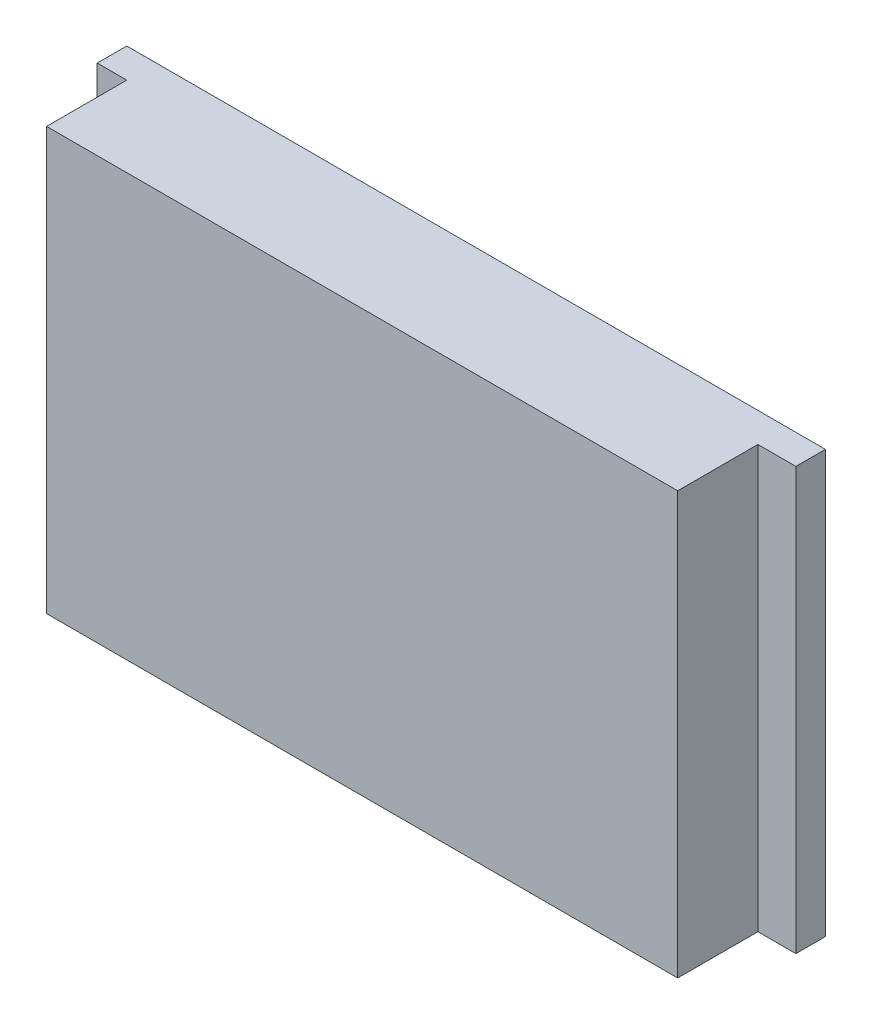
ISO-10303-21;
HEADER;
FILE_DESCRIPTION(('STEP AP214'),'2;1');
FILE_NAME('part.step','',(''),(''),'','','');
FILE_SCHEMA(('AUTOMOTIVE_DESIGN { 1 0 10303 214 1 1 1 1 }'));
ENDSEC;
DATA;
#1=APPLICATION_CONTEXT('core data for automotive mechanical design processes');
#2=APPLICATION_PROTOCOL_DEFINITION('international standard','automotive_design',2000,#1);
#3=PRODUCT_CONTEXT('',#1,'mechanical');
#4=PRODUCT('Part','Part','',(#3));
#5=PRODUCT_RELATED_PRODUCT_CATEGORY('part','',(#4));
#6=PRODUCT_DEFINITION_FORMATION('','',#4);
#7=PRODUCT_DEFINITION_CONTEXT('part definition',#1,'design');
#8=PRODUCT_DEFINITION('design','',#6,#7);
#9=PRODUCT_DEFINITION_SHAPE('','',#8);
#10=(LENGTH_UNIT() NAMED_UNIT(*) SI_UNIT(.MILLI.,.METRE.));
#11=(NAMED_UNIT(*) PLANE_ANGLE_UNIT() SI_UNIT($,.RADIAN.));
#12=(NAMED_UNIT(*) SI_UNIT($,.STERADIAN.) SOLID_ANGLE_UNIT());
#13=UNCERTAINTY_MEASURE_WITH_UNIT(LENGTH_MEASURE(1.E-05),#10,'distance_accuracy_value','');
#14=(GEOMETRIC_REPRESENTATION_CONTEXT(3) GLOBAL_UNCERTAINTY_ASSIGNED_CONTEXT((#13)) GLOBAL_UNIT_ASSIGNED_CONTEXT((#10,
#11,#12)) REPRESENTATION_CONTEXT('',''));
#15=CARTESIAN_POINT('',(0.,0.,0.));
#16=DIRECTION('',(0.,0.,1.));
#17=DIRECTION('',(1.,0.,0.));
#18=AXIS2_PLACEMENT_3D('',#15,#16,#17);
#19=CARTESIAN_POINT('',(0.,0.,7.));
#20=DIRECTION('',(0.,0.,1.));
#21=DIRECTION('',(1.,0.,0.));
#22=AXIS2_PLACEMENT_3D('',#19,#20,#21);
#23=PLANE('',#22);
#24=DIRECTION('',(0.,-1.,0.));
#25=VECTOR('',#24,1.);
#26=CARTESIAN_POINT('',(-75.78,50.,7.));
#27=LINE('',#26,#25);
#28=CARTESIAN_POINT('',(-75.78,50.,7.));
#29=VERTEX_POINT('',#28);
#30=CARTESIAN_POINT('',(-75.78,-50.,7.));
#31=VERTEX_POINT('',#30);
#32=EDGE_CURVE('E49',#29,#31,#27,.T.);
#33=ORIENTED_EDGE('',*,*,#32,.F.);
#34=DIRECTION('',(-1.,0.,0.));
#35=VECTOR('',#34,1.);
#36=CARTESIAN_POINT('',(-82.78,50.,7.));
#37=LINE('',#36,#35);
#38=CARTESIAN_POINT('',(-82.78,50.,7.));
#39=VERTEX_POINT('',#38);
#40=EDGE_CURVE('E138',#29,#39,#37,.T.);
#41=ORIENTED_EDGE('',*,*,#40,.T.);
#42=DIRECTION('',(0.,-1.,0.));
#43=VECTOR('',#42,1.);
#44=CARTESIAN_POINT('',(-82.78,50.,7.));
#45=LINE('',#44,#43);
#46=CARTESIAN_POINT('',(-82.78,-50.,7.));
#47=VERTEX_POINT('',#46);
#48=EDGE_CURVE('E129',#39,#47,#45,.T.);
#49=ORIENTED_EDGE('',*,*,#48,.T.);
#50=DIRECTION('',(1.,0.,0.));
#51=VECTOR('',#50,1.);
#52=CARTESIAN_POINT('',(-82.78,-50.,7.));
#53=LINE('',#52,#51);
#54=EDGE_CURVE('E134',#47,#31,#53,.T.);
#55=ORIENTED_EDGE('',*,*,#54,.T.);
#56=EDGE_LOOP('',(#33,#41,#49,#55));
#57=FACE_BOUND('',#56,.T.);
#58=ADVANCED_FACE('F34',(#57),#23,.T.);
#59=CARTESIAN_POINT('',(-82.78,50.,7.));
#60=DIRECTION('',(1.,0.,0.));
#61=DIRECTION('',(0.,0.,-1.));
#62=AXIS2_PLACEMENT_3D('',#59,#60,#61);
#63=PLANE('',#62);
#64=DIRECTION('',(0.,-1.,0.));
#65=VECTOR('',#64,1.);
#66=CARTESIAN_POINT('',(-82.78,50.,0.));
#67=LINE('',#66,#65);
#68=CARTESIAN_POINT('',(-82.78,50.,0.));
#69=VERTEX_POINT('',#68);
#70=CARTESIAN_POINT('',(-82.78,-50.,0.));
#71=VERTEX_POINT('',#70);
#72=EDGE_CURVE('E120',#69,#71,#67,.T.);
#73=ORIENTED_EDGE('',*,*,#72,.T.);
#74=DIRECTION('',(0.,0.,-1.));
#75=VECTOR('',#74,1.);
#76=CARTESIAN_POINT('',(-82.78,-50.,7.));
#77=LINE('',#76,#75);
#78=EDGE_CURVE('E11',#47,#71,#77,.T.);
#79=ORIENTED_EDGE('',*,*,#78,.F.);
#80=ORIENTED_EDGE('',*,*,#48,.F.);
#81=DIRECTION('',(0.,0.,-1.));
#82=VECTOR('',#81,1.);
#83=CARTESIAN_POINT('',(-82.78,50.,7.));
#84=LINE('',#83,#82);
#85=EDGE_CURVE('E140',#39,#69,#84,.T.);
#86=ORIENTED_EDGE('',*,*,#85,.T.);
#87=EDGE_LOOP('',(#73,#79,#80,#86));
#88=FACE_BOUND('',#87,.T.);
#89=ADVANCED_FACE('F36',(#88),#63,.F.);
#90=CARTESIAN_POINT('',(-82.78,-50.,7.));
#91=DIRECTION('',(0.,1.,0.));
#92=DIRECTION('',(-1.,0.,0.));
#93=AXIS2_PLACEMENT_3D('',#90,#91,#92);
#94=PLANE('',#93);
#95=DIRECTION('',(1.,0.,0.));
#96=VECTOR('',#95,1.);
#97=CARTESIAN_POINT('',(-82.78,-50.,0.));
#98=LINE('',#97,#96);
#99=CARTESIAN_POINT('',(82.78,-50.,0.));
#100=VERTEX_POINT('',#99);
#101=EDGE_CURVE('E123',#71,#100,#98,.T.);
#102=ORIENTED_EDGE('',*,*,#101,.T.);
#103=DIRECTION('',(0.,0.,-1.));
#104=VECTOR('',#103,1.);
#105=CARTESIAN_POINT('',(82.78,-50.,7.));
#106=LINE('',#105,#104);
#107=CARTESIAN_POINT('',(82.78,-50.,7.));
#108=VERTEX_POINT('',#107);
#109=EDGE_CURVE('E42',#108,#100,#106,.T.);
#110=ORIENTED_EDGE('',*,*,#109,.F.);
#111=CARTESIAN_POINT('',(73.78,-50.,7.));
#112=VERTEX_POINT('',#111);
#113=EDGE_CURVE('E132',#112,#108,#53,.T.);
#114=ORIENTED_EDGE('',*,*,#113,.F.);
#115=DIRECTION('',(0.,0.,-1.));
#116=VECTOR('',#115,1.);
#117=CARTESIAN_POINT('',(73.78,-50.,26.));
#118=LINE('',#117,#116);
#119=CARTESIAN_POINT('',(73.78,-50.,26.));
#120=VERTEX_POINT('',#119);
#121=EDGE_CURVE('E105',#120,#112,#118,.T.);
#122=ORIENTED_EDGE('',*,*,#121,.F.);
#123=DIRECTION('',(1.,0.,0.));
#124=VECTOR('',#123,1.);
#125=CARTESIAN_POINT('',(-75.78,-50.,26.));
#126=LINE('',#125,#124);
#127=CARTESIAN_POINT('',(-75.78,-50.,26.));
#128=VERTEX_POINT('',#127);
#129=EDGE_CURVE('E99',#128,#120,#126,.T.);
#130=ORIENTED_EDGE('',*,*,#129,.F.);
#131=DIRECTION('',(0.,0.,-1.));
#132=VECTOR('',#131,1.);
#133=CARTESIAN_POINT('',(-75.78,-50.,26.));
#134=LINE('',#133,#132);
#135=EDGE_CURVE('E103',#128,#31,#134,.T.);
#136=ORIENTED_EDGE('',*,*,#135,.T.);
#137=ORIENTED_EDGE('',*,*,#54,.F.);
#138=ORIENTED_EDGE('',*,*,#78,.T.);
#139=EDGE_LOOP('',(#102,#110,#114,#122,#130,#136,#137,#138));
#140=FACE_BOUND('',#139,.T.);
#141=ADVANCED_FACE('F101',(#140),#94,.F.);
#142=CARTESIAN_POINT('',(82.78,50.,7.));
#143=DIRECTION('',(-1.,0.,0.));
#144=DIRECTION('',(0.,0.,1.));
#145=AXIS2_PLACEMENT_3D('',#142,#143,#144);
#146=PLANE('',#145);
#147=DIRECTION('',(0.,1.,0.));
#148=VECTOR('',#147,1.);
#149=CARTESIAN_POINT('',(82.78,50.,0.));
#150=LINE('',#149,#148);
#151=CARTESIAN_POINT('',(82.78,50.,0.));
#152=VERTEX_POINT('',#151);
#153=EDGE_CURVE('E143',#100,#152,#150,.T.);
#154=ORIENTED_EDGE('',*,*,#153,.T.);
#155=DIRECTION('',(0.,0.,-1.));
#156=VECTOR('',#155,1.);
#157=CARTESIAN_POINT('',(82.78,50.,7.));
#158=LINE('',#157,#156);
#159=CARTESIAN_POINT('',(82.78,50.,7.));
#160=VERTEX_POINT('',#159);
#161=EDGE_CURVE('E148',#160,#152,#158,.T.);
#162=ORIENTED_EDGE('',*,*,#161,.F.);
#163=DIRECTION('',(0.,1.,0.));
#164=VECTOR('',#163,1.);
#165=CARTESIAN_POINT('',(82.78,50.,7.));
#166=LINE('',#165,#164);
#167=EDGE_CURVE('E136',#108,#160,#166,.T.);
#168=ORIENTED_EDGE('',*,*,#167,.F.);
#169=ORIENTED_EDGE('',*,*,#109,.T.);
#170=EDGE_LOOP('',(#154,#162,#168,#169));
#171=FACE_BOUND('',#170,.T.);
#172=ADVANCED_FACE('F155',(#171),#146,.F.);
#173=CARTESIAN_POINT('',(-82.78,50.,7.));
#174=DIRECTION('',(0.,-1.,0.));
#175=DIRECTION('',(1.,0.,0.));
#176=AXIS2_PLACEMENT_3D('',#173,#174,#175);
#177=PLANE('',#176);
#178=DIRECTION('',(-1.,0.,0.));
#179=VECTOR('',#178,1.);
#180=CARTESIAN_POINT('',(-82.78,50.,0.));
#181=LINE('',#180,#179);
#182=EDGE_CURVE('E133',#152,#69,#181,.T.);
#183=ORIENTED_EDGE('',*,*,#182,.T.);
#184=ORIENTED_EDGE('',*,*,#85,.F.);
#185=ORIENTED_EDGE('',*,*,#40,.F.);
#186=DIRECTION('',(0.,0.,-1.));
#187=VECTOR('',#186,1.);
#188=CARTESIAN_POINT('',(-75.78,50.,26.));
#189=LINE('',#188,#187);
#190=CARTESIAN_POINT('',(-75.78,50.,26.));
#191=VERTEX_POINT('',#190);
#192=EDGE_CURVE('E168',#191,#29,#189,.T.);
#193=ORIENTED_EDGE('',*,*,#192,.F.);
#194=DIRECTION('',(-1.,0.,0.));
#195=VECTOR('',#194,1.);
#196=CARTESIAN_POINT('',(-75.78,50.,26.));
#197=LINE('',#196,#195);
#198=CARTESIAN_POINT('',(73.78,50.,26.));
#199=VERTEX_POINT('',#198);
#200=EDGE_CURVE('E114',#199,#191,#197,.T.);
#201=ORIENTED_EDGE('',*,*,#200,.F.);
#202=DIRECTION('',(0.,0.,-1.));
#203=VECTOR('',#202,1.);
#204=CARTESIAN_POINT('',(73.78,50.,26.));
#205=LINE('',#204,#203);
#206=CARTESIAN_POINT('',(73.78,50.,7.));
#207=VERTEX_POINT('',#206);
#208=EDGE_CURVE('E125',#199,#207,#205,.T.);
#209=ORIENTED_EDGE('',*,*,#208,.T.);
#210=EDGE_CURVE('E139',#160,#207,#37,.T.);
#211=ORIENTED_EDGE('',*,*,#210,.F.);
#212=ORIENTED_EDGE('',*,*,#161,.T.);
#213=EDGE_LOOP('',(#183,#184,#185,#193,#201,#209,#211,#212));
#214=FACE_BOUND('',#213,.T.);
#215=ADVANCED_FACE('F163',(#214),#177,.F.);
#216=DIRECTION('',(0.,1.,0.));
#217=VECTOR('',#216,1.);
#218=CARTESIAN_POINT('',(73.78,50.,7.));
#219=LINE('',#218,#217);
#220=EDGE_CURVE('E57',#112,#207,#219,.T.);
#221=ORIENTED_EDGE('',*,*,#220,.F.);
#222=ORIENTED_EDGE('',*,*,#113,.T.);
#223=ORIENTED_EDGE('',*,*,#167,.T.);
#224=ORIENTED_EDGE('',*,*,#210,.T.);
#225=EDGE_LOOP('',(#221,#222,#223,#224));
#226=FACE_BOUND('',#225,.T.);
#227=ADVANCED_FACE('F178',(#226),#23,.T.);
#228=CARTESIAN_POINT('',(0.,0.,0.));
#229=DIRECTION('',(0.,0.,1.));
#230=DIRECTION('',(1.,0.,0.));
#231=AXIS2_PLACEMENT_3D('',#228,#229,#230);
#232=PLANE('',#231);
#233=ORIENTED_EDGE('',*,*,#72,.F.);
#234=ORIENTED_EDGE('',*,*,#182,.F.);
#235=ORIENTED_EDGE('',*,*,#153,.F.);
#236=ORIENTED_EDGE('',*,*,#101,.F.);
#237=EDGE_LOOP('',(#233,#234,#235,#236));
#238=FACE_BOUND('',#237,.T.);
#239=ADVANCED_FACE('F160',(#238),#232,.F.);
#240=CARTESIAN_POINT('',(-75.78,50.,26.));
#241=DIRECTION('',(1.,0.,0.));
#242=DIRECTION('',(0.,1.,0.));
#243=AXIS2_PLACEMENT_3D('',#240,#241,#242);
#244=PLANE('',#243);
#245=ORIENTED_EDGE('',*,*,#32,.T.);
#246=ORIENTED_EDGE('',*,*,#135,.F.);
#247=DIRECTION('',(0.,-1.,0.));
#248=VECTOR('',#247,1.);
#249=CARTESIAN_POINT('',(-75.78,50.,26.));
#250=LINE('',#249,#248);
#251=EDGE_CURVE('E109',#191,#128,#250,.T.);
#252=ORIENTED_EDGE('',*,*,#251,.F.);
#253=ORIENTED_EDGE('',*,*,#192,.T.);
#254=EDGE_LOOP('',(#245,#246,#252,#253));
#255=FACE_BOUND('',#254,.T.);
#256=ADVANCED_FACE('F119',(#255),#244,.F.);
#257=CARTESIAN_POINT('',(73.78,50.,26.));
#258=DIRECTION('',(-1.,0.,0.));
#259=DIRECTION('',(0.,0.,1.));
#260=AXIS2_PLACEMENT_3D('',#257,#258,#259);
#261=PLANE('',#260);
#262=ORIENTED_EDGE('',*,*,#220,.T.);
#263=ORIENTED_EDGE('',*,*,#208,.F.);
#264=DIRECTION('',(0.,1.,0.));
#265=VECTOR('',#264,1.);
#266=CARTESIAN_POINT('',(73.78,50.,26.));
#267=LINE('',#266,#265);
#268=EDGE_CURVE('E108',#120,#199,#267,.T.);
#269=ORIENTED_EDGE('',*,*,#268,.F.);
#270=ORIENTED_EDGE('',*,*,#121,.T.);
#271=EDGE_LOOP('',(#262,#263,#269,#270));
#272=FACE_BOUND('',#271,.T.);
#273=ADVANCED_FACE('F177',(#272),#261,.F.);
#274=CARTESIAN_POINT('',(0.,0.,26.));
#275=DIRECTION('',(0.,0.,1.));
#276=DIRECTION('',(1.,0.,0.));
#277=AXIS2_PLACEMENT_3D('',#274,#275,#276);
#278=PLANE('',#277);
#279=ORIENTED_EDGE('',*,*,#251,.T.);
#280=ORIENTED_EDGE('',*,*,#129,.T.);
#281=ORIENTED_EDGE('',*,*,#268,.T.);
#282=ORIENTED_EDGE('',*,*,#200,.T.);
#283=EDGE_LOOP('',(#279,#280,#281,#282));
#284=FACE_BOUND('',#283,.T.);
#285=ADVANCED_FACE('F112',(#284),#278,.T.);
#286=CLOSED_SHELL('',(#58,#89,#141,#172,#215,#227,#239,#256,#273,#285));
#287=MANIFOLD_SOLID_BREP('B2',#286);
#288=ADVANCED_BREP_SHAPE_REPRESENTATION('',(#18,#287),#14);
#289=SHAPE_DEFINITION_REPRESENTATION(#9,#288);
ENDSEC;
END-ISO-10303-21;
